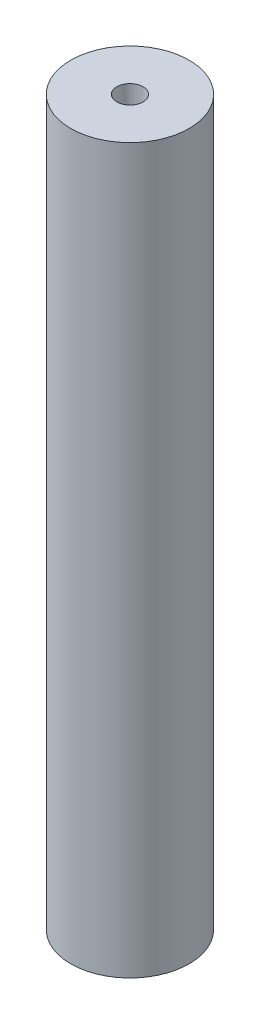
ISO-10303-21;
HEADER;
FILE_DESCRIPTION(('STEP AP214'),'2;1');
FILE_NAME('part.step','',(''),(''),'','','');
FILE_SCHEMA(('AUTOMOTIVE_DESIGN { 1 0 10303 214 1 1 1 1 }'));
ENDSEC;
DATA;
#1=APPLICATION_CONTEXT('core data for automotive mechanical design processes');
#2=APPLICATION_PROTOCOL_DEFINITION('international standard','automotive_design',2000,#1);
#3=PRODUCT_CONTEXT('',#1,'mechanical');
#4=PRODUCT('Part','Part','',(#3));
#5=PRODUCT_RELATED_PRODUCT_CATEGORY('part','',(#4));
#6=PRODUCT_DEFINITION_FORMATION('','',#4);
#7=PRODUCT_DEFINITION_CONTEXT('part definition',#1,'design');
#8=PRODUCT_DEFINITION('design','',#6,#7);
#9=PRODUCT_DEFINITION_SHAPE('','',#8);
#10=(LENGTH_UNIT() NAMED_UNIT(*) SI_UNIT(.MILLI.,.METRE.));
#11=(NAMED_UNIT(*) PLANE_ANGLE_UNIT() SI_UNIT($,.RADIAN.));
#12=(NAMED_UNIT(*) SI_UNIT($,.STERADIAN.) SOLID_ANGLE_UNIT());
#13=UNCERTAINTY_MEASURE_WITH_UNIT(LENGTH_MEASURE(1.E-05),#10,'distance_accuracy_value','');
#14=(GEOMETRIC_REPRESENTATION_CONTEXT(3) GLOBAL_UNCERTAINTY_ASSIGNED_CONTEXT((#13)) GLOBAL_UNIT_ASSIGNED_CONTEXT((#10,
#11,#12)) REPRESENTATION_CONTEXT('',''));
#15=CARTESIAN_POINT('',(0.,0.,0.));
#16=DIRECTION('',(0.,0.,1.));
#17=DIRECTION('',(1.,0.,0.));
#18=AXIS2_PLACEMENT_3D('',#15,#16,#17);
#19=CARTESIAN_POINT('',(0.,110.,0.));
#20=DIRECTION('',(0.,1.,0.));
#21=DIRECTION('',(0.,0.,1.));
#22=AXIS2_PLACEMENT_3D('',#19,#20,#21);
#23=PLANE('',#22);
#24=CARTESIAN_POINT('',(0.,110.,0.));
#25=DIRECTION('',(0.,1.,0.));
#26=DIRECTION('',(0.,0.,1.));
#27=AXIS2_PLACEMENT_3D('',#24,#25,#26);
#28=CIRCLE('',#27,9.);
#29=CARTESIAN_POINT('',(0.,110.,9.));
#30=VERTEX_POINT('',#29);
#31=EDGE_CURVE('E11',#30,#30,#28,.T.);
#32=ORIENTED_EDGE('',*,*,#31,.T.);
#33=EDGE_LOOP('',(#32));
#34=FACE_BOUND('',#33,.T.);
#35=CARTESIAN_POINT('',(0.,110.,0.));
#36=DIRECTION('',(0.,1.,0.));
#37=DIRECTION('',(0.,0.,1.));
#38=AXIS2_PLACEMENT_3D('',#35,#36,#37);
#39=CIRCLE('',#38,2.);
#40=CARTESIAN_POINT('',(0.,110.,2.));
#41=VERTEX_POINT('',#40);
#42=EDGE_CURVE('E56',#41,#41,#39,.T.);
#43=ORIENTED_EDGE('',*,*,#42,.F.);
#44=EDGE_LOOP('',(#43));
#45=FACE_BOUND('',#44,.T.);
#46=ADVANCED_FACE('F43',(#34,#45),#23,.T.);
#47=CARTESIAN_POINT('',(0.,0.,0.));
#48=DIRECTION('',(0.,1.,0.));
#49=DIRECTION('',(0.,0.,1.));
#50=AXIS2_PLACEMENT_3D('',#47,#48,#49);
#51=PLANE('',#50);
#52=CARTESIAN_POINT('',(0.,0.,0.));
#53=DIRECTION('',(0.,1.,0.));
#54=DIRECTION('',(0.,0.,1.));
#55=AXIS2_PLACEMENT_3D('',#52,#53,#54);
#56=CIRCLE('',#55,9.);
#57=CARTESIAN_POINT('',(0.,0.,9.));
#58=VERTEX_POINT('',#57);
#59=EDGE_CURVE('E47',#58,#58,#56,.T.);
#60=ORIENTED_EDGE('',*,*,#59,.F.);
#61=EDGE_LOOP('',(#60));
#62=FACE_BOUND('',#61,.T.);
#63=CARTESIAN_POINT('',(0.,0.,0.));
#64=DIRECTION('',(0.,1.,0.));
#65=DIRECTION('',(0.,0.,1.));
#66=AXIS2_PLACEMENT_3D('',#63,#64,#65);
#67=CIRCLE('',#66,2.);
#68=CARTESIAN_POINT('',(0.,0.,2.));
#69=VERTEX_POINT('',#68);
#70=EDGE_CURVE('E58',#69,#69,#67,.T.);
#71=ORIENTED_EDGE('',*,*,#70,.T.);
#72=EDGE_LOOP('',(#71));
#73=FACE_BOUND('',#72,.T.);
#74=ADVANCED_FACE('F70',(#62,#73),#51,.F.);
#75=CARTESIAN_POINT('',(0.,110.,0.));
#76=DIRECTION('',(0.,-1.,0.));
#77=DIRECTION('',(0.,0.,-1.));
#78=AXIS2_PLACEMENT_3D('',#75,#76,#77);
#79=CYLINDRICAL_SURFACE('',#78,9.);
#80=ORIENTED_EDGE('',*,*,#31,.F.);
#81=EDGE_LOOP('',(#80));
#82=FACE_BOUND('',#81,.T.);
#83=ORIENTED_EDGE('',*,*,#59,.T.);
#84=EDGE_LOOP('',(#83));
#85=FACE_BOUND('',#84,.T.);
#86=ADVANCED_FACE('F45',(#82,#85),#79,.T.);
#87=CARTESIAN_POINT('',(0.,110.,0.));
#88=DIRECTION('',(0.,-1.,0.));
#89=DIRECTION('',(0.,0.,-1.));
#90=AXIS2_PLACEMENT_3D('',#87,#88,#89);
#91=CYLINDRICAL_SURFACE('',#90,2.);
#92=ORIENTED_EDGE('',*,*,#42,.T.);
#93=EDGE_LOOP('',(#92));
#94=FACE_BOUND('',#93,.T.);
#95=ORIENTED_EDGE('',*,*,#70,.F.);
#96=EDGE_LOOP('',(#95));
#97=FACE_BOUND('',#96,.T.);
#98=ADVANCED_FACE('F66',(#94,#97),#91,.F.);
#99=CLOSED_SHELL('',(#46,#74,#86,#98));
#100=MANIFOLD_SOLID_BREP('B2',#99);
#101=ADVANCED_BREP_SHAPE_REPRESENTATION('',(#18,#100),#14);
#102=SHAPE_DEFINITION_REPRESENTATION(#9,#101);
ENDSEC;
END-ISO-10303-21;
